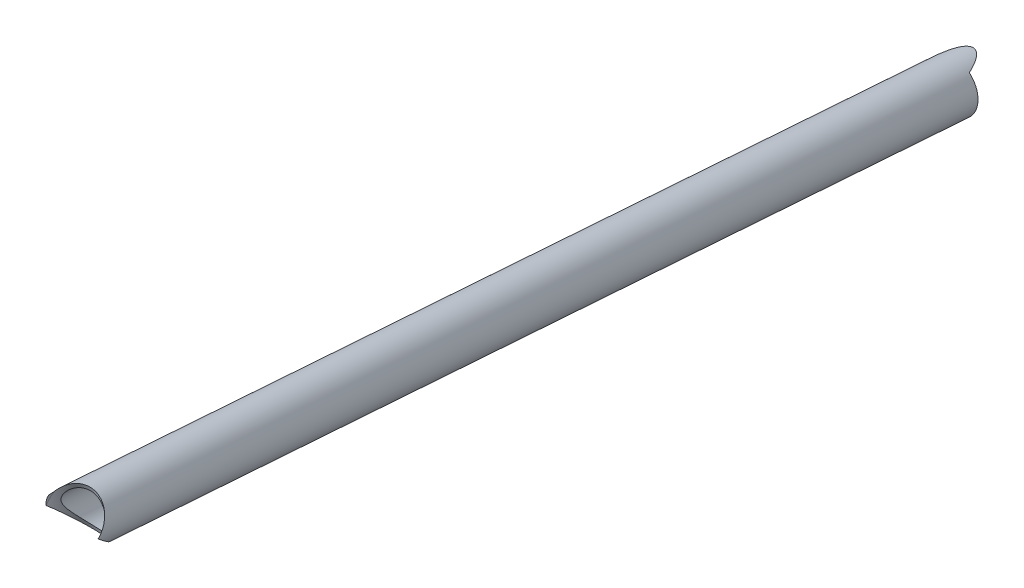
ISO-10303-21;
HEADER;
FILE_DESCRIPTION(('STEP AP214'),'2;1');
FILE_NAME('part.step','',(''),(''),'','','');
FILE_SCHEMA(('AUTOMOTIVE_DESIGN { 1 0 10303 214 1 1 1 1 }'));
ENDSEC;
DATA;
#1=APPLICATION_CONTEXT('core data for automotive mechanical design processes');
#2=APPLICATION_PROTOCOL_DEFINITION('international standard','automotive_design',2000,#1);
#3=PRODUCT_CONTEXT('',#1,'mechanical');
#4=PRODUCT('Part','Part','',(#3));
#5=PRODUCT_RELATED_PRODUCT_CATEGORY('part','',(#4));
#6=PRODUCT_DEFINITION_FORMATION('','',#4);
#7=PRODUCT_DEFINITION_CONTEXT('part definition',#1,'design');
#8=PRODUCT_DEFINITION('design','',#6,#7);
#9=PRODUCT_DEFINITION_SHAPE('','',#8);
#10=(LENGTH_UNIT() NAMED_UNIT(*) SI_UNIT(.MILLI.,.METRE.));
#11=(NAMED_UNIT(*) PLANE_ANGLE_UNIT() SI_UNIT($,.RADIAN.));
#12=(NAMED_UNIT(*) SI_UNIT($,.STERADIAN.) SOLID_ANGLE_UNIT());
#13=UNCERTAINTY_MEASURE_WITH_UNIT(LENGTH_MEASURE(1.E-05),#10,'distance_accuracy_value','');
#14=(GEOMETRIC_REPRESENTATION_CONTEXT(3) GLOBAL_UNCERTAINTY_ASSIGNED_CONTEXT((#13)) GLOBAL_UNIT_ASSIGNED_CONTEXT((#10,
#11,#12)) REPRESENTATION_CONTEXT('',''));
#15=CARTESIAN_POINT('',(0.,0.,0.));
#16=DIRECTION('',(0.,0.,1.));
#17=DIRECTION('',(1.,0.,0.));
#18=AXIS2_PLACEMENT_3D('',#15,#16,#17);
#19=CARTESIAN_POINT('',(250.,220.,-2000.));
#20=DIRECTION('',(0.171152156864514,0.228202875819352,0.958452078441276));
#21=DIRECTION('',(0.,-0.972806214685367,0.23162052730604));
#22=AXIS2_PLACEMENT_3D('',#19,#20,#21);
#23=CYLINDRICAL_SURFACE('',#22,7.90000000000002);
#24=CARTESIAN_POINT('',(322.090271514965,308.435192923939,-1594.46467735048));
#25=CARTESIAN_POINT('',(322.241784424069,308.437647561189,-1594.45437503883));
#26=CARTESIAN_POINT('',(322.392878238035,308.445696040376,-1594.43844222641));
#27=CARTESIAN_POINT('',(322.692760399366,308.472078411791,-1594.39635450053));
#28=CARTESIAN_POINT('',(322.841546469873,308.490421870804,-1594.37019008605));
#29=CARTESIAN_POINT('',(323.284038298838,308.559523009835,-1594.27784641601));
#30=CARTESIAN_POINT('',(323.572805325381,308.624320746827,-1594.19790392637));
#31=CARTESIAN_POINT('',(324.054722667237,308.760796591235,-1594.03670282022));
#32=CARTESIAN_POINT('',(324.252222118965,308.825610351166,-1593.9619284146));
#33=CARTESIAN_POINT('',(324.637930583342,308.967795130276,-1593.80086297085));
#34=CARTESIAN_POINT('',(324.826134260152,309.045173254706,-1593.71456542123));
#35=CARTESIAN_POINT('',(325.193247633719,309.210352161521,-1593.53280337883));
#36=CARTESIAN_POINT('',(325.372155973542,309.298154459517,-1593.43733755342));
#37=CARTESIAN_POINT('',(325.721180146492,309.482578048229,-1593.23903241097));
#38=CARTESIAN_POINT('',(325.891292740669,309.579202551921,-1593.13619041053));
#39=CARTESIAN_POINT('',(326.208618780442,309.771185705104,-1592.93389057627));
#40=CARTESIAN_POINT('',(326.3565325558,309.865913243234,-1592.83492596662));
#41=CARTESIAN_POINT('',(326.64582203285,310.060924626466,-1592.63297131942));
#42=CARTESIAN_POINT('',(326.787196616489,310.161209415334,-1592.52998059901));
#43=CARTESIAN_POINT('',(327.202251729331,310.469641970116,-1592.21598460984));
#44=CARTESIAN_POINT('',(327.4667017636,310.685268169048,-1592.00006092507));
#45=CARTESIAN_POINT('',(327.974771030626,311.134468603766,-1591.55885012381));
#46=CARTESIAN_POINT('',(328.218270744993,311.368133023034,-1591.333518943));
#47=CARTESIAN_POINT('',(328.684756801542,311.850860958247,-1590.87852538884));
#48=CARTESIAN_POINT('',(328.907753127637,312.099916879603,-1590.64886518981));
#49=CARTESIAN_POINT('',(329.23985339802,312.499397263855,-1590.29091252075));
#50=CARTESIAN_POINT('',(329.355598690809,312.644565351914,-1590.16284593537));
#51=CARTESIAN_POINT('',(329.581241912148,312.939773051785,-1589.9071817994));
#52=CARTESIAN_POINT('',(329.691140186099,313.089812374993,-1589.77958422151));
#53=CARTESIAN_POINT('',(329.905242367122,313.395201685108,-1589.52545737269));
#54=CARTESIAN_POINT('',(330.009438796805,313.550558230883,-1589.39892968024));
#55=CARTESIAN_POINT('',(330.211877964759,313.86677721543,-1589.14801013792));
#56=CARTESIAN_POINT('',(330.310120951662,314.027639423831,-1589.02361819901));
#57=CARTESIAN_POINT('',(330.499723879816,314.354235315566,-1588.77893353446));
#58=CARTESIAN_POINT('',(330.591127825265,314.519926188852,-1588.65861793804));
#59=CARTESIAN_POINT('',(330.767380269964,314.857960370392,-1588.42248895494));
#60=CARTESIAN_POINT('',(330.852227518512,315.030304938496,-1588.30667642932));
#61=CARTESIAN_POINT('',(331.014424109215,315.382029870162,-1588.08155727614));
#62=CARTESIAN_POINT('',(331.091789486591,315.56139397498,-1587.97223693782));
#63=CARTESIAN_POINT('',(331.238059322837,315.928304621825,-1587.76210071652));
#64=CARTESIAN_POINT('',(331.306968681726,316.115846338944,-1587.66127991901));
#65=CARTESIAN_POINT('',(331.417234954169,316.447522294866,-1587.49691760675));
#66=CARTESIAN_POINT('',(331.460979314315,316.589537533573,-1587.43071049555));
#67=CARTESIAN_POINT('',(331.542237959927,316.878511221257,-1587.30556754595));
#68=CARTESIAN_POINT('',(331.579752267277,317.025469652868,-1587.24663168201));
#69=CARTESIAN_POINT('',(331.647397964208,317.323879878734,-1587.13758104543));
#70=CARTESIAN_POINT('',(331.677547725234,317.475319413034,-1587.08744441232));
#71=CARTESIAN_POINT('',(331.729376413995,317.782607154821,-1586.9971954167));
#72=CARTESIAN_POINT('',(331.75105577661,317.938455135532,-1586.95708253959));
#73=CARTESIAN_POINT('',(331.784940237742,318.255905353923,-1586.88752862352));
#74=CARTESIAN_POINT('',(331.797006886525,318.417557816483,-1586.85824667898));
#75=CARTESIAN_POINT('',(331.810007160012,318.743048990446,-1586.81180386511));
#76=CARTESIAN_POINT('',(331.810941431322,318.906887574318,-1586.79464229184));
#77=CARTESIAN_POINT('',(331.800893843015,319.235119138201,-1586.77228370522));
#78=CARTESIAN_POINT('',(331.789904221314,319.399512409813,-1586.76709449238));
#79=CARTESIAN_POINT('',(331.755686052502,319.726984076938,-1586.76774419365));
#80=CARTESIAN_POINT('',(331.732457238411,319.89006244369,-1586.77358334834));
#81=CARTESIAN_POINT('',(331.67851476,320.187902060656,-1586.79304418195));
#82=CARTESIAN_POINT('',(331.649555587217,320.323078815993,-1586.80529565071));
#83=CARTESIAN_POINT('',(331.583308621185,320.590759397835,-1586.83538693581));
#84=CARTESIAN_POINT('',(331.546017975102,320.72326229178,-1586.85322866718));
#85=CARTESIAN_POINT('',(331.422098597468,321.116076283602,-1586.91341092174));
#86=CARTESIAN_POINT('',(331.32342711605,321.371667206237,-1586.96240642748));
#87=CARTESIAN_POINT('',(331.124013430922,321.808739960523,-1587.05684874383));
#88=CARTESIAN_POINT('',(331.029266662771,321.993465482926,-1587.10039970959));
#89=CARTESIAN_POINT('',(330.824190701973,322.35360228256,-1587.18975075308));
#90=CARTESIAN_POINT('',(330.713855448883,322.529009900536,-1587.23555170102));
#91=CARTESIAN_POINT('',(330.478707867665,322.870156105225,-1587.32685461971));
#92=CARTESIAN_POINT('',(330.35388091388,323.03588466544,-1587.37235623859));
#93=CARTESIAN_POINT('',(330.090914149447,323.357120412155,-1587.46092700027));
#94=CARTESIAN_POINT('',(329.952773714286,323.512627118589,-1587.50399602883));
#95=CARTESIAN_POINT('',(329.662279459789,323.814988337793,-1587.58653510277));
#96=CARTESIAN_POINT('',(329.509759949811,323.961698944729,-1587.62594917212));
#97=CARTESIAN_POINT('',(329.193172752926,324.243647617584,-1587.69904950772));
#98=CARTESIAN_POINT('',(329.029104837452,324.378885456315,-1587.73273566055));
#99=CARTESIAN_POINT('',(328.690595968018,324.637243256625,-1587.79315802986));
#100=CARTESIAN_POINT('',(328.516159727255,324.760368657666,-1587.81989737494));
#101=CARTESIAN_POINT('',(328.15800675575,324.993945868136,-1587.86546394095));
#102=CARTESIAN_POINT('',(327.974289870416,325.104397466351,-1587.88429103003));
#103=CARTESIAN_POINT('',(327.590511905696,325.316577916171,-1587.91389411448));
#104=CARTESIAN_POINT('',(327.390087330264,325.417705559117,-1587.92427753291));
#105=CARTESIAN_POINT('',(326.981983926491,325.60473813656,-1587.93490978674));
#106=CARTESIAN_POINT('',(326.774304834071,325.690642516211,-1587.93515825284));
#107=CARTESIAN_POINT('',(326.353317193824,325.846576730061,-1587.92509767862));
#108=CARTESIAN_POINT('',(326.140008731097,325.916606804081,-1587.91478879781));
#109=CARTESIAN_POINT('',(325.709461343401,326.040237742945,-1587.88342633818));
#110=CARTESIAN_POINT('',(325.492222597723,326.093839355227,-1587.8623732483));
#111=CARTESIAN_POINT('',(325.065111408071,326.18220872107,-1587.81073034667));
#112=CARTESIAN_POINT('',(324.855332423574,326.217697769979,-1587.78059799172));
#113=CARTESIAN_POINT('',(324.435300000795,326.273005478918,-1587.71080174202));
#114=CARTESIAN_POINT('',(324.225046576758,326.292824603323,-1587.67113812977));
#115=CARTESIAN_POINT('',(323.805596157887,326.316654226663,-1587.58272104175));
#116=CARTESIAN_POINT('',(323.59639900321,326.320667193742,-1587.53396898638));
#117=CARTESIAN_POINT('',(323.1804639997,326.312869787472,-1587.42798831476));
#118=CARTESIAN_POINT('',(322.973726167052,326.30105931005,-1587.37075964275));
#119=CARTESIAN_POINT('',(322.565520265246,326.26183423516,-1587.24905392649));
#120=CARTESIAN_POINT('',(322.364025154853,326.234531344331,-1587.18463139517));
#121=CARTESIAN_POINT('',(321.966001952822,326.16455869142,-1587.04915186586));
#122=CARTESIAN_POINT('',(321.769473838078,326.121889000838,-1586.97809489873));
#123=CARTESIAN_POINT('',(321.382382791046,326.021361959554,-1586.83041467952));
#124=CARTESIAN_POINT('',(321.191822654783,325.963497605785,-1586.75378887262));
#125=CARTESIAN_POINT('',(320.817724446236,325.832812282878,-1586.59627723901));
#126=CARTESIAN_POINT('',(320.634186484944,325.759991077447,-1586.51539134501));
#127=CARTESIAN_POINT('',(320.267446972521,325.596241372426,-1586.34738437441));
#128=CARTESIAN_POINT('',(320.084581278538,325.504682374018,-1586.26014403192));
#129=CARTESIAN_POINT('',(319.728185128106,325.305737841773,-1586.08457065857));
#130=CARTESIAN_POINT('',(319.554655839555,325.198350334191,-1585.99623749268));
#131=CARTESIAN_POINT('',(319.217686319519,324.967901100235,-1585.82081137634));
#132=CARTESIAN_POINT('',(319.054245232834,324.844840705206,-1585.73371832123));
#133=CARTESIAN_POINT('',(318.738111485297,324.583137734261,-1585.56357516237));
#134=CARTESIAN_POINT('',(318.585415643281,324.444499801955,-1585.48052386429));
#135=CARTESIAN_POINT('',(318.328669231755,324.188887671847,-1585.34201164662));
#136=CARTESIAN_POINT('',(318.222099616765,324.07533082292,-1585.28489360551));
#137=CARTESIAN_POINT('',(318.015567669822,323.839735738928,-1585.17652716373));
#138=CARTESIAN_POINT('',(317.9156037867,323.717699508911,-1585.12527738299));
#139=CARTESIAN_POINT('',(317.722749882295,323.465648410996,-1585.03064173473));
#140=CARTESIAN_POINT('',(317.629846647036,323.3356493128,-1584.98724095666));
#141=CARTESIAN_POINT('',(317.451234213236,323.068010180347,-1584.91025274496));
#142=CARTESIAN_POINT('',(317.365523635927,322.930371618951,-1584.87666342747));
#143=CARTESIAN_POINT('',(317.214327676452,322.670257831312,-1584.82562449484));
#144=CARTESIAN_POINT('',(317.147766814519,322.548740046312,-1584.80648000277));
#145=CARTESIAN_POINT('',(317.020179521972,322.30174579289,-1584.77771922889));
#146=CARTESIAN_POINT('',(316.959151982854,322.17627012418,-1584.7681010348));
#147=CARTESIAN_POINT('',(316.842760254209,321.922449983882,-1584.7591577055));
#148=CARTESIAN_POINT('',(316.787392512045,321.79410737429,-1584.75982607301));
#149=CARTESIAN_POINT('',(316.682275069114,321.535627812663,-1584.77177266267));
#150=CARTESIAN_POINT('',(316.632525532451,321.40549080834,-1584.78305119464));
#151=CARTESIAN_POINT('',(316.538679586797,321.145010775517,-1584.81602132804));
#152=CARTESIAN_POINT('',(316.494564743077,321.014669908834,-1584.83767781052));
#153=CARTESIAN_POINT('',(316.411560540613,320.754362690603,-1584.89080815507));
#154=CARTESIAN_POINT('',(316.372671267698,320.624396345241,-1584.92228217836));
#155=CARTESIAN_POINT('',(316.263288397513,320.236017172869,-1585.03024880254));
#156=CARTESIAN_POINT('',(316.200118886293,319.979235671711,-1585.12027074888));
#157=CARTESIAN_POINT('',(316.095328159298,319.496172435106,-1585.31880439655));
#158=CARTESIAN_POINT('',(316.052299919441,319.269195178155,-1585.42499200517));
#159=CARTESIAN_POINT('',(315.978067471013,318.822055321242,-1585.65474181204));
#160=CARTESIAN_POINT('',(315.946873864994,318.60189899346,-1585.77831945468));
#161=CARTESIAN_POINT('',(315.894769247574,318.16700731921,-1586.03897679742));
#162=CARTESIAN_POINT('',(315.873912796367,317.952306294696,-1586.17612365136));
#163=CARTESIAN_POINT('',(315.841732966862,317.528730499196,-1586.45998127141));
#164=CARTESIAN_POINT('',(315.830407061779,317.319854198141,-1586.60668949144));
#165=CARTESIAN_POINT('',(315.81641185208,316.898685836136,-1586.91333285508));
#166=CARTESIAN_POINT('',(315.814111481997,316.68659771479,-1587.07356301785));
#167=CARTESIAN_POINT('',(315.818871801566,316.266934529892,-1587.39974623354));
#168=CARTESIAN_POINT('',(315.825934328586,316.059360360279,-1587.56570040351));
#169=CARTESIAN_POINT('',(315.849406422517,315.647918258108,-1587.90194978006));
#170=CARTESIAN_POINT('',(315.865826461718,315.444054742487,-1588.07224964574));
#171=CARTESIAN_POINT('',(315.908217535997,315.039845067831,-1588.41577278514));
#172=CARTESIAN_POINT('',(315.934187792668,314.839498623524,-1588.58899581951));
#173=CARTESIAN_POINT('',(315.995963932056,314.442777061994,-1588.9366971129));
#174=CARTESIAN_POINT('',(316.031732354511,314.246389817713,-1589.11116817495));
#175=CARTESIAN_POINT('',(316.113740864194,313.856679002332,-1589.46111408126));
#176=CARTESIAN_POINT('',(316.159981813583,313.663355684877,-1589.63658900701));
#177=CARTESIAN_POINT('',(316.263664114113,313.28007122365,-1589.98743057861));
#178=CARTESIAN_POINT('',(316.32109175474,313.090106271596,-1590.16279709603));
#179=CARTESIAN_POINT('',(316.448185027812,312.713562249302,-1590.51267703818));
#180=CARTESIAN_POINT('',(316.517847773638,312.526982391849,-1590.68719065415));
#181=CARTESIAN_POINT('',(316.653018209639,312.200345198492,-1590.99419317008));
#182=CARTESIAN_POINT('',(316.715761796903,312.05950666214,-1591.1270684));
#183=CARTESIAN_POINT('',(316.849941027304,311.780404501318,-1591.3911389592));
#184=CARTESIAN_POINT('',(316.921376392993,311.642140794819,-1591.52233434196));
#185=CARTESIAN_POINT('',(317.07384836779,311.368467868835,-1591.78252490892));
#186=CARTESIAN_POINT('',(317.154896644382,311.233062358035,-1591.91151719749));
#187=CARTESIAN_POINT('',(317.327457742869,310.965914484896,-1592.16627846891));
#188=CARTESIAN_POINT('',(317.418970485442,310.834172094799,-1592.29204747619));
#189=CARTESIAN_POINT('',(317.614745757196,310.573591081519,-1592.54082615892));
#190=CARTESIAN_POINT('',(317.719150512933,310.444807667457,-1592.66378328472));
#191=CARTESIAN_POINT('',(317.940915760671,310.193116380903,-1592.90381466974));
#192=CARTESIAN_POINT('',(318.058279192517,310.070209850758,-1593.02088758524));
#193=CARTESIAN_POINT('',(318.43110835063,309.713299401669,-1593.35996237076));
#194=CARTESIAN_POINT('',(318.70818971018,309.489878785862,-1593.57099615079));
#195=CARTESIAN_POINT('',(319.200724773782,309.172191723297,-1593.8667185847));
#196=CARTESIAN_POINT('',(319.395954444754,309.062180412548,-1593.9680344307));
#197=CARTESIAN_POINT('',(319.704717512891,308.914227364004,-1594.10202488262));
#198=CARTESIAN_POINT('',(319.810310191147,308.867747465404,-1594.14369648794));
#199=CARTESIAN_POINT('',(320.026381217196,308.781134509689,-1594.22037501575));
#200=CARTESIAN_POINT('',(320.13685758868,308.74099891474,-1594.2553846043));
#201=CARTESIAN_POINT('',(320.363028422043,308.667365756628,-1594.31840724843));
#202=CARTESIAN_POINT('',(320.478758323366,308.633925494556,-1594.34636040146));
#203=CARTESIAN_POINT('',(320.713681870427,308.574598879902,-1594.39441919674));
#204=CARTESIAN_POINT('',(320.832873938881,308.548709145032,-1594.4145283541));
#205=CARTESIAN_POINT('',(321.073635621887,308.504784984709,-1594.44664529682));
#206=CARTESIAN_POINT('',(321.195202631825,308.486742408678,-1594.45866149523));
#207=CARTESIAN_POINT('',(321.439717799431,308.458555529761,-1594.47460499558));
#208=CARTESIAN_POINT('',(321.562665207796,308.448407133878,-1594.47853649105));
#209=CARTESIAN_POINT('',(321.753211712874,308.438686717117,-1594.47854111524));
#210=CARTESIAN_POINT('',(321.820696933841,308.436407214998,-1594.47736398183));
#211=CARTESIAN_POINT('',(321.955572822275,308.4341159679,-1594.4727195631));
#212=CARTESIAN_POINT('',(322.022963522535,308.434102477545,-1594.46925404245));
#213=CARTESIAN_POINT('',(322.090271514965,308.435192923939,-1594.46467735048));
#214=B_SPLINE_CURVE_WITH_KNOTS('',3,(#24,#25,#26,#27,#28,#29,#30,#31,#32,#33,#34,#35,#36,#37,
#38,#39,#40,#41,#42,#43,#44,#45,#46,#47,#48,#49,#50,#51,#52,#53,#54,#55,#56,#57,#58,#59,#60,#61,
#62,#63,#64,#65,#66,#67,#68,#69,#70,#71,#72,#73,#74,#75,#76,#77,#78,#79,#80,#81,#82,#83,#84,#85,
#86,#87,#88,#89,#90,#91,#92,#93,#94,#95,#96,#97,#98,#99,#100,#101,#102,#103,#104,#105,#106,#107,
#108,#109,#110,#111,#112,#113,#114,#115,#116,#117,#118,#119,#120,#121,#122,#123,#124,#125,#126,
#127,#128,#129,#130,#131,#132,#133,#134,#135,#136,#137,#138,#139,#140,#141,#142,#143,#144,#145,
#146,#147,#148,#149,#150,#151,#152,#153,#154,#155,#156,#157,#158,#159,#160,#161,#162,#163,#164,
#165,#166,#167,#168,#169,#170,#171,#172,#173,#174,#175,#176,#177,#178,#179,#180,#181,#182,#183,
#184,#185,#186,#187,#188,#189,#190,#191,#192,#193,#194,#195,#196,#197,#198,#199,#200,#201,#202,
#203,#204,#205,#206,#207,#208,#209,#210,#211,#212,#213),.UNSPECIFIED.,.T.,.F.,(4,2,2,2,2,2,2,2,
2,2,2,2,2,2,2,2,2,2,2,2,2,2,2,2,2,2,2,2,2,2,2,2,2,2,2,2,2,2,2,2,2,2,2,2,2,2,2,2,2,2,2,2,2,2,2,2,
2,2,2,2,2,2,2,2,2,2,2,2,2,2,2,2,2,2,2,2,2,2,2,2,2,2,2,2,2,2,2,2,2,2,2,2,2,2,4),(0.,
0.455556686507927,0.91153740939675,1.82668038152642,2.48861513485912,3.15092552987545,
3.81333233898208,4.47598136094281,5.08056003990909,5.68524170877951,6.8952549470262,
8.11176754436256,9.32768460101434,10.0042225757444,10.6807205408311,11.3580853904493,
12.0354219320023,12.7079386431842,13.3805833232682,14.0517528592694,14.7225316166747,
15.2102794060411,15.6980254821259,16.1845421178775,16.6710337719974,17.1644116074696,
17.6577607856759,18.1514313116868,18.6451126068625,19.0610588487761,19.4771477364994,
20.3094027889582,20.9450551703967,21.5809553623789,22.21750300508,22.8540805216596,
23.4991903445273,24.1443129390577,24.7891444860893,25.4339867779133,26.1073269339191,
26.7806916262677,27.4540461450936,28.1273700240618,28.7712402266173,29.4150913475185,
30.0588419265761,30.7025967396404,31.3417677498906,31.9809357861787,32.6203989271848,
33.2598721714122,33.9261206418016,34.5924522608361,35.2587273155881,35.9248042803722,
36.4220318289941,36.9191421999478,37.4152980693826,37.9113586117967,38.3305118865467,
38.7495810048331,39.1683854382163,39.5872021014325,40.0046113932692,40.4220275403098,
41.2572133861242,42.0189061781678,42.7812797620842,43.5476354565909,44.3137879070905,
45.110950717479,45.9082699857075,46.706483316534,47.5046316019531,48.2997700058723,
49.0949738942194,49.8892092367078,50.6832574470568,51.2936923266094,51.904107725806,
52.5152717360123,53.1264311138812,53.7450640692339,54.363837659023,55.5957068048433,
56.3306799000896,56.6982866445619,57.065745965615,57.4362270395101,57.8065418991936,
58.1764712014729,58.5462085736316,58.7487407679807,58.9511169627786),.UNSPECIFIED.);
#215=CARTESIAN_POINT('',(322.090271514965,308.435192923939,-1594.46467735048));
#216=VERTEX_POINT('',#215);
#217=EDGE_CURVE('E93',#216,#216,#214,.T.);
#218=ORIENTED_EDGE('',*,*,#217,.T.);
#219=EDGE_LOOP('',(#218));
#220=FACE_BOUND('',#219,.T.);
#221=CARTESIAN_POINT('',(257.5,230.,-1958.));
#222=DIRECTION('',(0.,-1.,0.));
#223=DIRECTION('',(0.175790638483658,0.,0.984427575508482));
#224=AXIS2_PLACEMENT_3D('',#221,#222,#223);
#225=ELLIPSE('',#224,34.6183192110767,7.90000000000002);
#226=CARTESIAN_POINT('',(249.317399497778,230.,-1990.));
#227=VERTEX_POINT('',#226);
#228=CARTESIAN_POINT('',(254.867149858445,230.,-1990.));
#229=VERTEX_POINT('',#228);
#230=EDGE_CURVE('E82',#227,#229,#225,.T.);
#231=ORIENTED_EDGE('',*,*,#230,.T.);
#232=CARTESIAN_POINT('',(251.785714285714,222.380952380952,-1990.));
#233=DIRECTION('',(0.,0.,-1.));
#234=DIRECTION('',(0.6,0.8,0.));
#235=AXIS2_PLACEMENT_3D('',#232,#233,#234);
#236=ELLIPSE('',#235,8.24245695501827,7.90000000000002);
#237=EDGE_CURVE('E86',#229,#227,#236,.T.);
#238=ORIENTED_EDGE('',*,*,#237,.T.);
#239=EDGE_LOOP('',(#231,#238));
#240=FACE_BOUND('',#239,.T.);
#241=ADVANCED_FACE('F41',(#220,#240),#23,.F.);
#242=CARTESIAN_POINT('',(325.,320.,-1580.));
#243=DIRECTION('',(-0.214351342090107,-0.914565726251124,-0.342962147344171));
#244=DIRECTION('',(0.,0.351123441588392,-0.936329177569045));
#245=AXIS2_PLACEMENT_3D('',#242,#243,#244);
#246=CYLINDRICAL_SURFACE('',#245,9.49999999999999);
#247=ORIENTED_EDGE('',*,*,#217,.F.);
#248=EDGE_LOOP('',(#247));
#249=FACE_BOUND('',#248,.T.);
#250=CARTESIAN_POINT('',(325.,320.,-1580.));
#251=DIRECTION('',(-0.0468068915155631,-0.743683273485426,0.666891523146495));
#252=DIRECTION('',(0.217268286027578,0.644059979147453,0.733472041148959));
#253=AXIS2_PLACEMENT_3D('',#250,#251,#252);
#254=ELLIPSE('',#253,20.5867526008063,9.49999999999999);
#255=CARTESIAN_POINT('',(315.341374922451,320.385714809063,-1580.24777727505));
#256=VERTEX_POINT('',#255);
#257=CARTESIAN_POINT('',(334.262395776099,318.297353717629,-1581.24860727374));
#258=VERTEX_POINT('',#257);
#259=EDGE_CURVE('E103',#256,#258,#254,.T.);
#260=ORIENTED_EDGE('',*,*,#259,.T.);
#261=CARTESIAN_POINT('',(325.,320.,-1580.));
#262=DIRECTION('',(0.217268286027578,0.644059979147453,0.733472041148959));
#263=DIRECTION('',(-0.0468068915155631,-0.743683273485426,0.666891523146495));
#264=AXIS2_PLACEMENT_3D('',#261,#262,#263);
#265=ELLIPSE('',#264,10.7083267615423,9.49999999999999);
#266=CARTESIAN_POINT('',(316.850455147292,324.957595377924,-1581.93920293328));
#267=VERTEX_POINT('',#266);
#268=EDGE_CURVE('E127',#258,#267,#265,.T.);
#269=ORIENTED_EDGE('',*,*,#268,.T.);
#270=CARTESIAN_POINT('',(325.,320.,-1580.));
#271=DIRECTION('',(0.0100583123703583,-0.349879267870479,-0.936740801004567));
#272=DIRECTION('',(0.287052887423583,0.898369431045867,-0.332465043552115));
#273=AXIS2_PLACEMENT_3D('',#270,#271,#272);
#274=ELLIPSE('',#273,14.8646950385778,9.49999999999999);
#275=EDGE_CURVE('E132',#256,#267,#274,.T.);
#276=ORIENTED_EDGE('',*,*,#275,.F.);
#277=EDGE_LOOP('',(#260,#269,#276));
#278=FACE_BOUND('',#277,.T.);
#279=ADVANCED_FACE('F43',(#249,#278),#246,.F.);
#280=CARTESIAN_POINT('',(169.428571428571,0.,-994.999999999999));
#281=DIRECTION('',(0.227207840964846,0.4673512982197,-0.85437659205789));
#282=DIRECTION('',(0.,0.877321812102288,0.479902529696977));
#283=AXIS2_PLACEMENT_3D('',#280,#281,#282);
#284=CYLINDRICAL_SURFACE('',#283,9.49999999999999);
#285=CARTESIAN_POINT('',(325.,320.,-1580.));
#286=DIRECTION('',(0.49284846485847,0.860535216309269,0.128761532214443));
#287=DIRECTION('',(-0.0306416701609083,-0.130725495483689,0.990944969652853));
#288=AXIS2_PLACEMENT_3D('',#285,#286,#287);
#289=ELLIPSE('',#288,23.5066795946768,9.49999999999999);
#290=CARTESIAN_POINT('',(316.749201071937,324.717084971521,-1579.94427024051));
#291=VERTEX_POINT('',#290);
#292=EDGE_CURVE('E144',#267,#291,#289,.T.);
#293=ORIENTED_EDGE('',*,*,#292,.T.);
#294=CARTESIAN_POINT('',(316.09829094194,323.366491923361,-1579.83114794765));
#295=CARTESIAN_POINT('',(316.121098978319,323.424736891112,-1579.83556026774));
#296=CARTESIAN_POINT('',(316.144457695867,323.48276271823,-1579.84001874741));
#297=CARTESIAN_POINT('',(316.192268235119,323.598355557724,-1579.84902166232));
#298=CARTESIAN_POINT('',(316.216720056823,323.6559225701,-1579.85356609756));
#299=CARTESIAN_POINT('',(316.266708546208,323.770577246634,-1579.86273456001));
#300=CARTESIAN_POINT('',(316.292245213889,323.827664910792,-1579.86735858721));
#301=CARTESIAN_POINT('',(316.344394619414,323.941340583759,-1579.87667983145));
#302=CARTESIAN_POINT('',(316.371007357258,323.997928592569,-1579.88137704849));
#303=CARTESIAN_POINT('',(316.42529975485,324.110584821776,-1579.89083824518));
#304=CARTESIAN_POINT('',(316.452979414598,324.166653042174,-1579.89560222483));
#305=CARTESIAN_POINT('',(316.509396091895,324.278249764085,-1579.90519049354));
#306=CARTESIAN_POINT('',(316.538133109444,324.333778265599,-1579.9100147826));
#307=CARTESIAN_POINT('',(316.596654571411,324.444275805369,-1579.91971719568));
#308=CARTESIAN_POINT('',(316.626439015829,324.499244843626,-1579.92459531971));
#309=CARTESIAN_POINT('',(316.687044902633,324.608603980949,-1579.93439890331));
#310=CARTESIAN_POINT('',(316.717866345018,324.662994080016,-1579.93932436288));
#311=CARTESIAN_POINT('',(316.749201071937,324.717084971521,-1579.94427024051));
#312=B_SPLINE_CURVE_WITH_KNOTS('',3,(#294,#295,#296,#297,#298,#299,#300,#301,#302,#303,#304,
#305,#306,#307,#308,#309,#310,#311),.UNSPECIFIED.,.F.,.F.,(4,2,2,2,2,2,2,2,4),(0.,
0.188117784784449,0.376235569568873,0.564353354353335,0.752471139137736,0.940588923922204,
1.12870670870663,1.31682449349112,1.50494227827556),.UNSPECIFIED.);
#313=CARTESIAN_POINT('',(316.09829094194,323.366491923361,-1579.83114794765));
#314=VERTEX_POINT('',#313);
#315=EDGE_CURVE('E96',#314,#291,#312,.T.);
#316=ORIENTED_EDGE('',*,*,#315,.F.);
#317=CARTESIAN_POINT('',(325.,320.,-1580.));
#318=DIRECTION('',(-0.0306416701609083,-0.130725495483689,0.990944969652853));
#319=DIRECTION('',(0.49284846485847,0.860535216309269,0.128761532214443));
#320=AXIS2_PLACEMENT_3D('',#317,#318,#319);
#321=ELLIPSE('',#320,10.3859535817137,9.49999999999999);
#322=EDGE_CURVE('E135',#314,#256,#321,.T.);
#323=ORIENTED_EDGE('',*,*,#322,.T.);
#324=ORIENTED_EDGE('',*,*,#275,.T.);
#325=EDGE_LOOP('',(#293,#316,#323,#324));
#326=FACE_BOUND('',#325,.T.);
#327=ADVANCED_FACE('F111',(#326),#284,.F.);
#328=CARTESIAN_POINT('',(250.,220.,-2000.));
#329=DIRECTION('',(0.171152156864514,0.228202875819352,0.958452078441276));
#330=DIRECTION('',(0.,-0.972806214685367,0.23162052730604));
#331=AXIS2_PLACEMENT_3D('',#328,#329,#330);
#332=CYLINDRICAL_SURFACE('',#331,9.49999999999999);
#333=ORIENTED_EDGE('',*,*,#322,.F.);
#334=ORIENTED_EDGE('',*,*,#315,.T.);
#335=ORIENTED_EDGE('',*,*,#292,.F.);
#336=ORIENTED_EDGE('',*,*,#268,.F.);
#337=ORIENTED_EDGE('',*,*,#259,.F.);
#338=EDGE_LOOP('',(#333,#334,#335,#336,#337));
#339=FACE_BOUND('',#338,.T.);
#340=CARTESIAN_POINT('',(251.785714285714,222.380952380952,-1990.));
#341=DIRECTION('',(0.,0.,-1.));
#342=DIRECTION('',(0.6,0.8,0.));
#343=AXIS2_PLACEMENT_3D('',#340,#341,#342);
#344=ELLIPSE('',#343,9.91181532565485,9.49999999999999);
#345=CARTESIAN_POINT('',(258.123863276632,230.,-1990.));
#346=VERTEX_POINT('',#345);
#347=CARTESIAN_POINT('',(246.060686079592,230.,-1990.));
#348=VERTEX_POINT('',#347);
#349=EDGE_CURVE('E11',#346,#348,#344,.T.);
#350=ORIENTED_EDGE('',*,*,#349,.F.);
#351=CARTESIAN_POINT('',(257.5,230.,-1958.));
#352=DIRECTION('',(0.,-1.,0.));
#353=DIRECTION('',(0.175790638483658,0.,0.984427575508482));
#354=AXIS2_PLACEMENT_3D('',#351,#352,#353);
#355=ELLIPSE('',#354,41.6296243677503,9.49999999999999);
#356=EDGE_CURVE('E50',#348,#346,#355,.T.);
#357=ORIENTED_EDGE('',*,*,#356,.F.);
#358=EDGE_LOOP('',(#350,#357));
#359=FACE_BOUND('',#358,.T.);
#360=ADVANCED_FACE('F114',(#339,#359),#332,.T.);
#361=CARTESIAN_POINT('',(-250.,230.,-1990.));
#362=DIRECTION('',(0.,-1.,0.));
#363=DIRECTION('',(0.,0.,-1.));
#364=AXIS2_PLACEMENT_3D('',#361,#362,#363);
#365=PLANE('',#364);
#366=DIRECTION('',(1.,0.,0.));
#367=VECTOR('',#366,1.);
#368=CARTESIAN_POINT('',(-250.,230.,-1990.));
#369=LINE('',#368,#367);
#370=EDGE_CURVE('E62',#348,#227,#369,.T.);
#371=ORIENTED_EDGE('',*,*,#370,.F.);
#372=ORIENTED_EDGE('',*,*,#356,.T.);
#373=EDGE_CURVE('E57',#229,#346,#369,.T.);
#374=ORIENTED_EDGE('',*,*,#373,.F.);
#375=ORIENTED_EDGE('',*,*,#230,.F.);
#376=EDGE_LOOP('',(#371,#372,#374,#375));
#377=FACE_BOUND('',#376,.T.);
#378=ADVANCED_FACE('F83',(#377),#365,.T.);
#379=CARTESIAN_POINT('',(-250.,210.,-1990.));
#380=DIRECTION('',(0.,0.,-1.));
#381=DIRECTION('',(-1.,0.,0.));
#382=AXIS2_PLACEMENT_3D('',#379,#380,#381);
#383=PLANE('',#382);
#384=ORIENTED_EDGE('',*,*,#373,.T.);
#385=ORIENTED_EDGE('',*,*,#349,.T.);
#386=ORIENTED_EDGE('',*,*,#370,.T.);
#387=ORIENTED_EDGE('',*,*,#237,.F.);
#388=EDGE_LOOP('',(#384,#385,#386,#387));
#389=FACE_BOUND('',#388,.T.);
#390=ADVANCED_FACE('F89',(#389),#383,.T.);
#391=CLOSED_SHELL('',(#241,#279,#327,#360,#378,#390));
#392=MANIFOLD_SOLID_BREP('B2',#391);
#393=ADVANCED_BREP_SHAPE_REPRESENTATION('',(#18,#392),#14);
#394=SHAPE_DEFINITION_REPRESENTATION(#9,#393);
ENDSEC;
END-ISO-10303-21;
